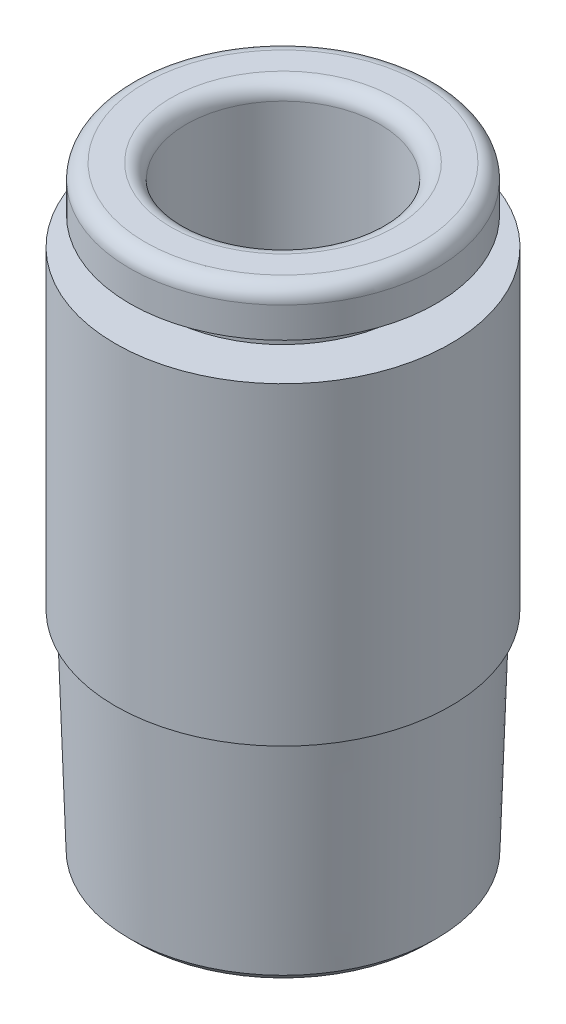
ISO-10303-21;
HEADER;
FILE_DESCRIPTION(('STEP AP214'),'2;1');
FILE_NAME('part.step','',(''),(''),'','','');
FILE_SCHEMA(('AUTOMOTIVE_DESIGN { 1 0 10303 214 1 1 1 1 }'));
ENDSEC;
DATA;
#1=APPLICATION_CONTEXT('core data for automotive mechanical design processes');
#2=APPLICATION_PROTOCOL_DEFINITION('international standard','automotive_design',2000,#1);
#3=PRODUCT_CONTEXT('',#1,'mechanical');
#4=PRODUCT('Part','Part','',(#3));
#5=PRODUCT_RELATED_PRODUCT_CATEGORY('part','',(#4));
#6=PRODUCT_DEFINITION_FORMATION('','',#4);
#7=PRODUCT_DEFINITION_CONTEXT('part definition',#1,'design');
#8=PRODUCT_DEFINITION('design','',#6,#7);
#9=PRODUCT_DEFINITION_SHAPE('','',#8);
#10=(LENGTH_UNIT() NAMED_UNIT(*) SI_UNIT(.MILLI.,.METRE.));
#11=(NAMED_UNIT(*) PLANE_ANGLE_UNIT() SI_UNIT($,.RADIAN.));
#12=(NAMED_UNIT(*) SI_UNIT($,.STERADIAN.) SOLID_ANGLE_UNIT());
#13=UNCERTAINTY_MEASURE_WITH_UNIT(LENGTH_MEASURE(1.E-05),#10,'distance_accuracy_value','');
#14=(GEOMETRIC_REPRESENTATION_CONTEXT(3) GLOBAL_UNCERTAINTY_ASSIGNED_CONTEXT((#13)) GLOBAL_UNIT_ASSIGNED_CONTEXT((#10,
#11,#12)) REPRESENTATION_CONTEXT('',''));
#15=CARTESIAN_POINT('',(0.,0.,0.));
#16=DIRECTION('',(0.,0.,1.));
#17=DIRECTION('',(1.,0.,0.));
#18=AXIS2_PLACEMENT_3D('',#15,#16,#17);
#19=CARTESIAN_POINT('',(0.,-15.3,4.76));
#20=DIRECTION('',(0.,-1.,0.));
#21=DIRECTION('',(0.,0.,-1.));
#22=AXIS2_PLACEMENT_3D('',#19,#20,#21);
#23=PLANE('',#22);
#24=DIRECTION('',(-1.,0.,0.));
#25=VECTOR('',#24,1.);
#26=CARTESIAN_POINT('',(1.37409364067131,-15.3,-2.3101584610165));
#27=LINE('',#26,#25);
#28=CARTESIAN_POINT('',(1.33377060933857,-15.3,-2.3101584610165));
#29=VERTEX_POINT('',#28);
#30=CARTESIAN_POINT('',(0.,-15.3,-2.3101584610165));
#31=VERTEX_POINT('',#30);
#32=EDGE_CURVE('E149',#29,#31,#27,.T.);
#33=ORIENTED_EDGE('',*,*,#32,.T.);
#34=CARTESIAN_POINT('',(0.,-15.3,0.));
#35=DIRECTION('',(0.,-1.,0.));
#36=DIRECTION('',(0.,0.,-1.));
#37=AXIS2_PLACEMENT_3D('',#34,#35,#36);
#38=CIRCLE('',#37,2.3101584610165);
#39=CARTESIAN_POINT('',(2.00065591400786,-15.3,-1.15507923050825));
#40=VERTEX_POINT('',#39);
#41=EDGE_CURVE('E11',#31,#40,#38,.T.);
#42=ORIENTED_EDGE('',*,*,#41,.T.);
#43=DIRECTION('',(-0.5,0.,-0.866025403784439));
#44=VECTOR('',#43,1.);
#45=CARTESIAN_POINT('',(2.68770273434351,-15.3,0.0349207694917477));
#46=LINE('',#45,#44);
#47=EDGE_CURVE('E156',#40,#29,#46,.T.);
#48=ORIENTED_EDGE('',*,*,#47,.T.);
#49=EDGE_LOOP('',(#33,#42,#48));
#50=FACE_BOUND('',#49,.T.);
#51=ADVANCED_FACE('F37',(#50),#23,.F.);
#52=CARTESIAN_POINT('',(2.66754121867714,-15.3,0.));
#53=VERTEX_POINT('',#52);
#54=EDGE_CURVE('E153',#53,#40,#46,.T.);
#55=ORIENTED_EDGE('',*,*,#54,.T.);
#56=CARTESIAN_POINT('',(2.00065591400786,-15.3,1.15507923050825));
#57=VERTEX_POINT('',#56);
#58=EDGE_CURVE('E46',#40,#57,#38,.T.);
#59=ORIENTED_EDGE('',*,*,#58,.T.);
#60=DIRECTION('',(0.5,0.,-0.866025403784438));
#61=VECTOR('',#60,1.);
#62=CARTESIAN_POINT('',(1.3136090936722,-15.3,2.34507923050825));
#63=LINE('',#62,#61);
#64=EDGE_CURVE('E227',#57,#53,#63,.T.);
#65=ORIENTED_EDGE('',*,*,#64,.T.);
#66=EDGE_LOOP('',(#55,#59,#65));
#67=FACE_BOUND('',#66,.T.);
#68=ADVANCED_FACE('F251',(#67),#23,.F.);
#69=CARTESIAN_POINT('',(1.33377060933857,-15.3,2.3101584610165));
#70=VERTEX_POINT('',#69);
#71=EDGE_CURVE('E123',#70,#57,#63,.T.);
#72=ORIENTED_EDGE('',*,*,#71,.T.);
#73=CARTESIAN_POINT('',(0.,-15.3,0.));
#74=DIRECTION('',(0.,1.,0.));
#75=DIRECTION('',(0.,0.,1.));
#76=AXIS2_PLACEMENT_3D('',#73,#74,#75);
#77=CIRCLE('',#76,2.3101584610165);
#78=CARTESIAN_POINT('',(0.,-15.3,2.3101584610165));
#79=VERTEX_POINT('',#78);
#80=EDGE_CURVE('E109',#79,#57,#77,.T.);
#81=ORIENTED_EDGE('',*,*,#80,.F.);
#82=DIRECTION('',(1.,0.,0.));
#83=VECTOR('',#82,1.);
#84=CARTESIAN_POINT('',(-1.37409364067131,-15.3,2.3101584610165));
#85=LINE('',#84,#83);
#86=EDGE_CURVE('E120',#79,#70,#85,.T.);
#87=ORIENTED_EDGE('',*,*,#86,.T.);
#88=EDGE_LOOP('',(#72,#81,#87));
#89=FACE_BOUND('',#88,.T.);
#90=ADVANCED_FACE('F119',(#89),#23,.F.);
#91=CARTESIAN_POINT('',(-1.33377060933857,-15.3,2.3101584610165));
#92=VERTEX_POINT('',#91);
#93=EDGE_CURVE('E130',#92,#79,#85,.T.);
#94=ORIENTED_EDGE('',*,*,#93,.T.);
#95=CARTESIAN_POINT('',(-2.00065591400786,-15.3,1.15507923050825));
#96=VERTEX_POINT('',#95);
#97=EDGE_CURVE('E106',#79,#96,#38,.T.);
#98=ORIENTED_EDGE('',*,*,#97,.T.);
#99=DIRECTION('',(0.5,0.,0.866025403784439));
#100=VECTOR('',#99,1.);
#101=CARTESIAN_POINT('',(-2.68770273434351,-15.3,-0.0349207694917475));
#102=LINE('',#101,#100);
#103=EDGE_CURVE('E135',#96,#92,#102,.T.);
#104=ORIENTED_EDGE('',*,*,#103,.T.);
#105=EDGE_LOOP('',(#94,#98,#104));
#106=FACE_BOUND('',#105,.T.);
#107=ADVANCED_FACE('F134',(#106),#23,.F.);
#108=CARTESIAN_POINT('',(-2.66754121867714,-15.3,0.));
#109=VERTEX_POINT('',#108);
#110=EDGE_CURVE('E132',#109,#96,#102,.T.);
#111=ORIENTED_EDGE('',*,*,#110,.T.);
#112=CARTESIAN_POINT('',(-2.00065591400786,-15.3,-1.15507923050825));
#113=VERTEX_POINT('',#112);
#114=EDGE_CURVE('E112',#96,#113,#38,.T.);
#115=ORIENTED_EDGE('',*,*,#114,.T.);
#116=DIRECTION('',(-0.5,0.,0.866025403784439));
#117=VECTOR('',#116,1.);
#118=CARTESIAN_POINT('',(-1.3136090936722,-15.3,-2.34507923050825));
#119=LINE('',#118,#117);
#120=EDGE_CURVE('E148',#113,#109,#119,.T.);
#121=ORIENTED_EDGE('',*,*,#120,.T.);
#122=EDGE_LOOP('',(#111,#115,#121));
#123=FACE_BOUND('',#122,.T.);
#124=ADVANCED_FACE('F200',(#123),#23,.F.);
#125=CARTESIAN_POINT('',(0.,0.,0.));
#126=DIRECTION('',(0.,1.,0.));
#127=DIRECTION('',(0.,0.,1.));
#128=AXIS2_PLACEMENT_3D('',#125,#126,#127);
#129=CYLINDRICAL_SURFACE('',#128,3.925);
#130=CARTESIAN_POINT('',(0.,-2.4,0.));
#131=DIRECTION('',(0.,1.,0.));
#132=DIRECTION('',(0.,0.,1.));
#133=AXIS2_PLACEMENT_3D('',#130,#131,#132);
#134=CIRCLE('',#133,3.925);
#135=CARTESIAN_POINT('',(0.,-2.4,3.925));
#136=VERTEX_POINT('',#135);
#137=EDGE_CURVE('E169',#136,#136,#134,.F.);
#138=ORIENTED_EDGE('',*,*,#137,.F.);
#139=EDGE_LOOP('',(#138));
#140=FACE_BOUND('',#139,.T.);
#141=CARTESIAN_POINT('',(0.,-1.5,0.));
#142=DIRECTION('',(0.,1.,0.));
#143=DIRECTION('',(0.,0.,1.));
#144=AXIS2_PLACEMENT_3D('',#141,#142,#143);
#145=CIRCLE('',#144,3.925);
#146=CARTESIAN_POINT('',(0.,-1.5,3.925));
#147=VERTEX_POINT('',#146);
#148=EDGE_CURVE('E181',#147,#147,#145,.T.);
#149=ORIENTED_EDGE('',*,*,#148,.F.);
#150=EDGE_LOOP('',(#149));
#151=FACE_BOUND('',#150,.T.);
#152=ADVANCED_FACE('F315',(#140,#151),#129,.T.);
#153=CARTESIAN_POINT('',(-5.025,-1.5,0.));
#154=DIRECTION('',(0.,-1.,0.));
#155=DIRECTION('',(0.,0.,-1.));
#156=AXIS2_PLACEMENT_3D('',#153,#154,#155);
#157=PLANE('',#156);
#158=ORIENTED_EDGE('',*,*,#148,.T.);
#159=EDGE_LOOP('',(#158));
#160=FACE_BOUND('',#159,.T.);
#161=CARTESIAN_POINT('',(0.,-1.5,0.));
#162=DIRECTION('',(0.,1.,0.));
#163=DIRECTION('',(0.,0.,1.));
#164=AXIS2_PLACEMENT_3D('',#161,#162,#163);
#165=CIRCLE('',#164,5.025);
#166=CARTESIAN_POINT('',(0.,-1.5,5.025));
#167=VERTEX_POINT('',#166);
#168=EDGE_CURVE('E178',#167,#167,#165,.T.);
#169=ORIENTED_EDGE('',*,*,#168,.F.);
#170=EDGE_LOOP('',(#169));
#171=FACE_BOUND('',#170,.T.);
#172=ADVANCED_FACE('F311',(#160,#171),#157,.T.);
#173=CARTESIAN_POINT('',(0.,0.,0.));
#174=DIRECTION('',(0.,1.,0.));
#175=DIRECTION('',(0.,0.,1.));
#176=AXIS2_PLACEMENT_3D('',#173,#174,#175);
#177=CYLINDRICAL_SURFACE('',#176,5.025);
#178=ORIENTED_EDGE('',*,*,#168,.T.);
#179=EDGE_LOOP('',(#178));
#180=FACE_BOUND('',#179,.T.);
#181=CARTESIAN_POINT('',(0.,-0.500000000000001,0.));
#182=DIRECTION('',(0.,1.,0.));
#183=DIRECTION('',(0.,0.,1.));
#184=AXIS2_PLACEMENT_3D('',#181,#182,#183);
#185=CIRCLE('',#184,5.025);
#186=CARTESIAN_POINT('',(0.,-0.500000000000001,5.025));
#187=VERTEX_POINT('',#186);
#188=EDGE_CURVE('E175',#187,#187,#185,.T.);
#189=ORIENTED_EDGE('',*,*,#188,.F.);
#190=EDGE_LOOP('',(#189));
#191=FACE_BOUND('',#190,.T.);
#192=ADVANCED_FACE('F307',(#180,#191),#177,.T.);
#193=CARTESIAN_POINT('',(0.,-0.500000000000001,0.));
#194=DIRECTION('',(0.,1.,0.));
#195=DIRECTION('',(0.,0.,1.));
#196=AXIS2_PLACEMENT_3D('',#193,#194,#195);
#197=TOROIDAL_SURFACE('',#196,4.525,0.5);
#198=ORIENTED_EDGE('',*,*,#188,.T.);
#199=EDGE_LOOP('',(#198));
#200=FACE_BOUND('',#199,.T.);
#201=CARTESIAN_POINT('',(0.,0.,0.));
#202=DIRECTION('',(0.,1.,0.));
#203=DIRECTION('',(0.,0.,1.));
#204=AXIS2_PLACEMENT_3D('',#201,#202,#203);
#205=CIRCLE('',#204,4.525);
#206=CARTESIAN_POINT('',(0.,0.,4.525));
#207=VERTEX_POINT('',#206);
#208=EDGE_CURVE('E172',#207,#207,#205,.T.);
#209=ORIENTED_EDGE('',*,*,#208,.F.);
#210=EDGE_LOOP('',(#209));
#211=FACE_BOUND('',#210,.T.);
#212=ADVANCED_FACE('F304',(#200,#211),#197,.T.);
#213=CARTESIAN_POINT('',(0.,0.,0.));
#214=DIRECTION('',(0.,1.,0.));
#215=DIRECTION('',(0.,0.,1.));
#216=AXIS2_PLACEMENT_3D('',#213,#214,#215);
#217=PLANE('',#216);
#218=CARTESIAN_POINT('',(0.,0.,0.));
#219=DIRECTION('',(0.,1.,0.));
#220=DIRECTION('',(0.,0.,1.));
#221=AXIS2_PLACEMENT_3D('',#218,#219,#220);
#222=CIRCLE('',#221,3.675);
#223=CARTESIAN_POINT('',(0.,0.,3.675));
#224=VERTEX_POINT('',#223);
#225=EDGE_CURVE('E192',#224,#224,#222,.F.);
#226=ORIENTED_EDGE('',*,*,#225,.T.);
#227=EDGE_LOOP('',(#226));
#228=FACE_BOUND('',#227,.T.);
#229=ORIENTED_EDGE('',*,*,#208,.T.);
#230=EDGE_LOOP('',(#229));
#231=FACE_BOUND('',#230,.T.);
#232=ADVANCED_FACE('F300',(#228,#231),#217,.T.);
#233=CARTESIAN_POINT('',(0.,-28.256349186104,0.));
#234=DIRECTION('',(0.,1.,0.));
#235=DIRECTION('',(0.,0.,1.));
#236=AXIS2_PLACEMENT_3D('',#233,#234,#235);
#237=CYLINDRICAL_SURFACE('',#236,5.5);
#238=CARTESIAN_POINT('',(0.,-12.7,0.));
#239=DIRECTION('',(0.,1.,0.));
#240=DIRECTION('',(0.,0.,1.));
#241=AXIS2_PLACEMENT_3D('',#238,#239,#240);
#242=CIRCLE('',#241,5.5);
#243=CARTESIAN_POINT('',(0.,-12.7,5.5));
#244=VERTEX_POINT('',#243);
#245=EDGE_CURVE('E166',#244,#244,#242,.F.);
#246=CARTESIAN_POINT('',(0.,-2.4,0.));
#247=DIRECTION('',(0.,1.,0.));
#248=DIRECTION('',(0.,0.,1.));
#249=AXIS2_PLACEMENT_3D('',#246,#247,#248);
#250=CIRCLE('',#249,5.5);
#251=CARTESIAN_POINT('',(0.,-2.4,5.5));
#252=VERTEX_POINT('',#251);
#253=EDGE_CURVE('E163',#252,#252,#250,.T.);
#254=CARTESIAN_POINT('',(0.,-12.7,5.5));
#255=CARTESIAN_POINT('',(0.,-12.5927083333333,5.5));
#256=CARTESIAN_POINT('',(0.,-12.4854166666667,5.5));
#257=CARTESIAN_POINT('',(0.,-12.2708333333333,5.5));
#258=CARTESIAN_POINT('',(0.,-12.1635416666667,5.5));
#259=CARTESIAN_POINT('',(0.,-11.9489583333333,5.5));
#260=CARTESIAN_POINT('',(0.,-11.8416666666667,5.5));
#261=CARTESIAN_POINT('',(0.,-11.6270833333333,5.5));
#262=CARTESIAN_POINT('',(0.,-11.5197916666667,5.5));
#263=CARTESIAN_POINT('',(0.,-11.3052083333333,5.5));
#264=CARTESIAN_POINT('',(0.,-11.1979166666667,5.5));
#265=CARTESIAN_POINT('',(0.,-10.9833333333333,5.5));
#266=CARTESIAN_POINT('',(0.,-10.8760416666667,5.5));
#267=CARTESIAN_POINT('',(0.,-10.6614583333333,5.5));
#268=CARTESIAN_POINT('',(0.,-10.5541666666667,5.5));
#269=CARTESIAN_POINT('',(0.,-10.3395833333333,5.5));
#270=CARTESIAN_POINT('',(0.,-10.2322916666667,5.5));
#271=CARTESIAN_POINT('',(0.,-10.0177083333333,5.5));
#272=CARTESIAN_POINT('',(0.,-9.91041666666667,5.5));
#273=CARTESIAN_POINT('',(0.,-9.69583333333334,5.5));
#274=CARTESIAN_POINT('',(0.,-9.58854166666667,5.5));
#275=CARTESIAN_POINT('',(0.,-9.37395833333334,5.5));
#276=CARTESIAN_POINT('',(0.,-9.26666666666667,5.5));
#277=CARTESIAN_POINT('',(0.,-9.05208333333333,5.5));
#278=CARTESIAN_POINT('',(0.,-8.94479166666667,5.5));
#279=CARTESIAN_POINT('',(0.,-8.73020833333334,5.5));
#280=CARTESIAN_POINT('',(0.,-8.62291666666667,5.5));
#281=CARTESIAN_POINT('',(0.,-8.40833333333333,5.5));
#282=CARTESIAN_POINT('',(0.,-8.30104166666667,5.5));
#283=CARTESIAN_POINT('',(0.,-8.08645833333333,5.5));
#284=CARTESIAN_POINT('',(0.,-7.97916666666667,5.5));
#285=CARTESIAN_POINT('',(0.,-7.76458333333333,5.5));
#286=CARTESIAN_POINT('',(0.,-7.65729166666667,5.5));
#287=CARTESIAN_POINT('',(0.,-7.44270833333333,5.5));
#288=CARTESIAN_POINT('',(0.,-7.33541666666667,5.5));
#289=CARTESIAN_POINT('',(0.,-7.12083333333334,5.5));
#290=CARTESIAN_POINT('',(0.,-7.01354166666667,5.5));
#291=CARTESIAN_POINT('',(0.,-6.79895833333333,5.5));
#292=CARTESIAN_POINT('',(0.,-6.69166666666667,5.5));
#293=CARTESIAN_POINT('',(0.,-6.47708333333333,5.5));
#294=CARTESIAN_POINT('',(0.,-6.36979166666667,5.5));
#295=CARTESIAN_POINT('',(0.,-6.15520833333333,5.5));
#296=CARTESIAN_POINT('',(0.,-6.04791666666667,5.5));
#297=CARTESIAN_POINT('',(0.,-5.83333333333333,5.5));
#298=CARTESIAN_POINT('',(0.,-5.72604166666667,5.5));
#299=CARTESIAN_POINT('',(0.,-5.51145833333333,5.5));
#300=CARTESIAN_POINT('',(0.,-5.40416666666667,5.5));
#301=CARTESIAN_POINT('',(0.,-5.18958333333333,5.5));
#302=CARTESIAN_POINT('',(0.,-5.08229166666667,5.5));
#303=CARTESIAN_POINT('',(0.,-4.86770833333333,5.5));
#304=CARTESIAN_POINT('',(0.,-4.76041666666667,5.5));
#305=CARTESIAN_POINT('',(0.,-4.54583333333334,5.5));
#306=CARTESIAN_POINT('',(0.,-4.43854166666667,5.5));
#307=CARTESIAN_POINT('',(0.,-4.22395833333333,5.5));
#308=CARTESIAN_POINT('',(0.,-4.11666666666667,5.5));
#309=CARTESIAN_POINT('',(0.,-3.90208333333333,5.5));
#310=CARTESIAN_POINT('',(0.,-3.79479166666667,5.5));
#311=CARTESIAN_POINT('',(0.,-3.58020833333333,5.5));
#312=CARTESIAN_POINT('',(0.,-3.47291666666667,5.5));
#313=CARTESIAN_POINT('',(0.,-3.25833333333333,5.5));
#314=CARTESIAN_POINT('',(0.,-3.15104166666667,5.5));
#315=CARTESIAN_POINT('',(0.,-2.93645833333333,5.5));
#316=CARTESIAN_POINT('',(0.,-2.82916666666667,5.5));
#317=CARTESIAN_POINT('',(0.,-2.61458333333333,5.5));
#318=CARTESIAN_POINT('',(0.,-2.50729166666667,5.5));
#319=CARTESIAN_POINT('',(0.,-2.4,5.5));
#320=B_SPLINE_CURVE_WITH_KNOTS('',3,(#254,#255,#256,#257,#258,#259,#260,#261,#262,#263,#264,
#265,#266,#267,#268,#269,#270,#271,#272,#273,#274,#275,#276,#277,#278,#279,#280,#281,#282,#283,
#284,#285,#286,#287,#288,#289,#290,#291,#292,#293,#294,#295,#296,#297,#298,#299,#300,#301,#302,
#303,#304,#305,#306,#307,#308,#309,#310,#311,#312,#313,#314,#315,#316,#317,#318,#319),
.UNSPECIFIED.,.F.,.F.,(4,2,2,2,2,2,2,2,2,2,2,2,2,2,2,2,2,2,2,2,2,2,2,2,2,2,2,2,2,2,2,2,4),(0.,
0.321874999999998,0.643749999999997,0.965625,1.2875,1.609375,1.93125,2.253125,2.575,2.896875,
3.21875,3.540625,3.8625,4.184375,4.50625,4.828125,5.15,5.471875,5.79375,6.115625,6.4375,
6.759375,7.08125,7.403125,7.725,8.046875,8.36875,8.690625,9.0125,9.334375,9.65625,9.978125,
10.3),.UNSPECIFIED.);
#321=EDGE_CURVE('BSEAM296',#244,#252,#320,.T.);
#322=ORIENTED_EDGE('',*,*,#245,.F.);
#323=ORIENTED_EDGE('',*,*,#253,.F.);
#324=ORIENTED_EDGE('',*,*,#321,.T.);
#325=ORIENTED_EDGE('',*,*,#321,.F.);
#326=EDGE_LOOP('',(#322,#324,#323,#325));
#327=FACE_BOUND('',#326,.T.);
#328=ADVANCED_FACE('F296',(#327),#237,.T.);
#329=CARTESIAN_POINT('',(0.,-2.4,0.));
#330=DIRECTION('',(0.,1.,0.));
#331=DIRECTION('',(0.,0.,1.));
#332=AXIS2_PLACEMENT_3D('',#329,#330,#331);
#333=PLANE('',#332);
#334=ORIENTED_EDGE('',*,*,#137,.T.);
#335=EDGE_LOOP('',(#334));
#336=FACE_BOUND('',#335,.T.);
#337=ORIENTED_EDGE('',*,*,#253,.T.);
#338=EDGE_LOOP('',(#337));
#339=FACE_BOUND('',#338,.T.);
#340=ADVANCED_FACE('F292',(#336,#339),#333,.T.);
#341=CARTESIAN_POINT('',(0.,-12.7,0.));
#342=DIRECTION('',(0.,1.,0.));
#343=DIRECTION('',(0.,0.,1.));
#344=AXIS2_PLACEMENT_3D('',#341,#342,#343);
#345=PLANE('',#344);
#346=CARTESIAN_POINT('',(0.,-12.7,0.));
#347=DIRECTION('',(0.,1.,0.));
#348=DIRECTION('',(0.,0.,1.));
#349=AXIS2_PLACEMENT_3D('',#346,#347,#348);
#350=CIRCLE('',#349,5.24748929625027);
#351=CARTESIAN_POINT('',(0.,-12.7,5.24748929625027));
#352=VERTEX_POINT('',#351);
#353=EDGE_CURVE('E160',#352,#352,#350,.T.);
#354=ORIENTED_EDGE('',*,*,#353,.T.);
#355=EDGE_LOOP('',(#354));
#356=FACE_BOUND('',#355,.T.);
#357=ORIENTED_EDGE('',*,*,#245,.T.);
#358=EDGE_LOOP('',(#357));
#359=FACE_BOUND('',#358,.T.);
#360=ADVANCED_FACE('F289',(#356,#359),#345,.F.);
#361=CARTESIAN_POINT('',(-5.02634744213624,-19.8,0.));
#362=DIRECTION('',(0.,-1.,0.));
#363=DIRECTION('',(0.,0.,-1.));
#364=AXIS2_PLACEMENT_3D('',#361,#362,#363);
#365=PLANE('',#364);
#366=CARTESIAN_POINT('',(0.,-19.8,0.));
#367=DIRECTION('',(0.,1.,0.));
#368=DIRECTION('',(0.,0.,1.));
#369=AXIS2_PLACEMENT_3D('',#366,#367,#368);
#370=CIRCLE('',#369,2.3101584610165);
#371=CARTESIAN_POINT('',(0.,-19.8,2.3101584610165));
#372=VERTEX_POINT('',#371);
#373=EDGE_CURVE('E124',#372,#372,#370,.T.);
#374=ORIENTED_EDGE('',*,*,#373,.T.);
#375=EDGE_LOOP('',(#374));
#376=FACE_BOUND('',#375,.T.);
#377=CARTESIAN_POINT('',(0.,-19.8,0.));
#378=DIRECTION('',(0.,-1.,0.));
#379=DIRECTION('',(0.,0.,-1.));
#380=AXIS2_PLACEMENT_3D('',#377,#378,#379);
#381=CIRCLE('',#380,4.77634744213624);
#382=CARTESIAN_POINT('',(0.,-19.8,-4.77634744213624));
#383=VERTEX_POINT('',#382);
#384=EDGE_CURVE('E187',#383,#383,#381,.T.);
#385=ORIENTED_EDGE('',*,*,#384,.T.);
#386=EDGE_LOOP('',(#385));
#387=FACE_BOUND('',#386,.T.);
#388=ADVANCED_FACE('F240',(#376,#387),#365,.T.);
#389=CARTESIAN_POINT('',(0.,-12.7,0.));
#390=DIRECTION('',(0.,1.,0.));
#391=DIRECTION('',(0.,0.,1.));
#392=AXIS2_PLACEMENT_3D('',#389,#390,#391);
#393=CONICAL_SURFACE('',#392,5.24748929625027,0.031136673855583);
#394=CARTESIAN_POINT('',(0.,-19.5419629882815,0.));
#395=DIRECTION('',(0.,-1.,0.));
#396=DIRECTION('',(0.,0.,-1.));
#397=AXIS2_PLACEMENT_3D('',#394,#395,#396);
#398=CIRCLE('',#397,5.03438445385476);
#399=CARTESIAN_POINT('',(0.,-19.5419629882815,-5.03438445385476));
#400=VERTEX_POINT('',#399);
#401=EDGE_CURVE('E184',#400,#400,#398,.F.);
#402=ORIENTED_EDGE('',*,*,#401,.T.);
#403=EDGE_LOOP('',(#402));
#404=FACE_BOUND('',#403,.T.);
#405=ORIENTED_EDGE('',*,*,#353,.F.);
#406=EDGE_LOOP('',(#405));
#407=FACE_BOUND('',#406,.T.);
#408=ADVANCED_FACE('F283',(#404,#407),#393,.T.);
#409=CARTESIAN_POINT('',(0.,-19.5419629882815,0.));
#410=DIRECTION('',(0.,1.,0.));
#411=DIRECTION('',(0.,0.,1.));
#412=AXIS2_PLACEMENT_3D('',#409,#410,#411);
#413=CONICAL_SURFACE('',#412,5.03438445385476,0.785398163397445);
#414=ORIENTED_EDGE('',*,*,#384,.F.);
#415=EDGE_LOOP('',(#414));
#416=FACE_BOUND('',#415,.T.);
#417=ORIENTED_EDGE('',*,*,#401,.F.);
#418=EDGE_LOOP('',(#417));
#419=FACE_BOUND('',#418,.T.);
#420=ADVANCED_FACE('F281',(#416,#419),#413,.T.);
#421=CARTESIAN_POINT('',(0.,-22.2802561210692,0.));
#422=DIRECTION('',(0.,1.,0.));
#423=DIRECTION('',(0.,0.,1.));
#424=AXIS2_PLACEMENT_3D('',#421,#422,#423);
#425=CYLINDRICAL_SURFACE('',#424,3.175);
#426=CARTESIAN_POINT('',(0.,-0.5,0.));
#427=DIRECTION('',(0.,1.,0.));
#428=DIRECTION('',(0.,0.,1.));
#429=AXIS2_PLACEMENT_3D('',#426,#427,#428);
#430=CIRCLE('',#429,3.175);
#431=CARTESIAN_POINT('',(0.,-0.5,3.175));
#432=VERTEX_POINT('',#431);
#433=EDGE_CURVE('E190',#432,#432,#430,.T.);
#434=CARTESIAN_POINT('',(0.,-13.3,0.));
#435=DIRECTION('',(0.,1.,0.));
#436=DIRECTION('',(0.,0.,1.));
#437=AXIS2_PLACEMENT_3D('',#434,#435,#436);
#438=CIRCLE('',#437,3.175);
#439=CARTESIAN_POINT('',(0.,-13.3,3.175));
#440=VERTEX_POINT('',#439);
#441=EDGE_CURVE('E157',#440,#440,#438,.F.);
#442=CARTESIAN_POINT('',(0.,-0.5,3.175));
#443=CARTESIAN_POINT('',(0.,-0.633333333333334,3.175));
#444=CARTESIAN_POINT('',(0.,-0.766666666666668,3.175));
#445=CARTESIAN_POINT('',(0.,-1.03333333333333,3.175));
#446=CARTESIAN_POINT('',(0.,-1.16666666666667,3.175));
#447=CARTESIAN_POINT('',(0.,-1.43333333333333,3.175));
#448=CARTESIAN_POINT('',(0.,-1.56666666666667,3.175));
#449=CARTESIAN_POINT('',(0.,-1.83333333333333,3.175));
#450=CARTESIAN_POINT('',(0.,-1.96666666666667,3.175));
#451=CARTESIAN_POINT('',(0.,-2.23333333333334,3.175));
#452=CARTESIAN_POINT('',(0.,-2.36666666666667,3.175));
#453=CARTESIAN_POINT('',(0.,-2.63333333333333,3.175));
#454=CARTESIAN_POINT('',(0.,-2.76666666666667,3.175));
#455=CARTESIAN_POINT('',(0.,-3.03333333333333,3.175));
#456=CARTESIAN_POINT('',(0.,-3.16666666666667,3.175));
#457=CARTESIAN_POINT('',(0.,-3.43333333333333,3.175));
#458=CARTESIAN_POINT('',(0.,-3.56666666666667,3.175));
#459=CARTESIAN_POINT('',(0.,-3.83333333333333,3.175));
#460=CARTESIAN_POINT('',(0.,-3.96666666666667,3.175));
#461=CARTESIAN_POINT('',(0.,-4.23333333333333,3.175));
#462=CARTESIAN_POINT('',(0.,-4.36666666666667,3.175));
#463=CARTESIAN_POINT('',(0.,-4.63333333333333,3.175));
#464=CARTESIAN_POINT('',(0.,-4.76666666666667,3.175));
#465=CARTESIAN_POINT('',(0.,-5.03333333333333,3.175));
#466=CARTESIAN_POINT('',(0.,-5.16666666666667,3.175));
#467=CARTESIAN_POINT('',(0.,-5.43333333333333,3.175));
#468=CARTESIAN_POINT('',(0.,-5.56666666666667,3.175));
#469=CARTESIAN_POINT('',(0.,-5.83333333333333,3.175));
#470=CARTESIAN_POINT('',(0.,-5.96666666666667,3.175));
#471=CARTESIAN_POINT('',(0.,-6.23333333333333,3.175));
#472=CARTESIAN_POINT('',(0.,-6.36666666666667,3.175));
#473=CARTESIAN_POINT('',(0.,-6.63333333333333,3.175));
#474=CARTESIAN_POINT('',(0.,-6.76666666666667,3.175));
#475=CARTESIAN_POINT('',(0.,-7.03333333333333,3.175));
#476=CARTESIAN_POINT('',(0.,-7.16666666666667,3.175));
#477=CARTESIAN_POINT('',(0.,-7.43333333333333,3.175));
#478=CARTESIAN_POINT('',(0.,-7.56666666666667,3.175));
#479=CARTESIAN_POINT('',(0.,-7.83333333333333,3.175));
#480=CARTESIAN_POINT('',(0.,-7.96666666666667,3.175));
#481=CARTESIAN_POINT('',(0.,-8.23333333333333,3.175));
#482=CARTESIAN_POINT('',(0.,-8.36666666666667,3.175));
#483=CARTESIAN_POINT('',(0.,-8.63333333333333,3.175));
#484=CARTESIAN_POINT('',(0.,-8.76666666666667,3.175));
#485=CARTESIAN_POINT('',(0.,-9.03333333333333,3.175));
#486=CARTESIAN_POINT('',(0.,-9.16666666666667,3.175));
#487=CARTESIAN_POINT('',(0.,-9.43333333333333,3.175));
#488=CARTESIAN_POINT('',(0.,-9.56666666666667,3.175));
#489=CARTESIAN_POINT('',(0.,-9.83333333333333,3.175));
#490=CARTESIAN_POINT('',(0.,-9.96666666666667,3.175));
#491=CARTESIAN_POINT('',(0.,-10.2333333333333,3.175));
#492=CARTESIAN_POINT('',(0.,-10.3666666666667,3.175));
#493=CARTESIAN_POINT('',(0.,-10.6333333333333,3.175));
#494=CARTESIAN_POINT('',(0.,-10.7666666666667,3.175));
#495=CARTESIAN_POINT('',(0.,-11.0333333333333,3.175));
#496=CARTESIAN_POINT('',(0.,-11.1666666666667,3.175));
#497=CARTESIAN_POINT('',(0.,-11.4333333333333,3.175));
#498=CARTESIAN_POINT('',(0.,-11.5666666666667,3.175));
#499=CARTESIAN_POINT('',(0.,-11.8333333333333,3.175));
#500=CARTESIAN_POINT('',(0.,-11.9666666666667,3.175));
#501=CARTESIAN_POINT('',(0.,-12.2333333333333,3.175));
#502=CARTESIAN_POINT('',(0.,-12.3666666666667,3.175));
#503=CARTESIAN_POINT('',(0.,-12.6333333333333,3.175));
#504=CARTESIAN_POINT('',(0.,-12.7666666666667,3.175));
#505=CARTESIAN_POINT('',(0.,-13.0333333333333,3.175));
#506=CARTESIAN_POINT('',(0.,-13.1666666666667,3.175));
#507=CARTESIAN_POINT('',(0.,-13.3,3.175));
#508=B_SPLINE_CURVE_WITH_KNOTS('',3,(#442,#443,#444,#445,#446,#447,#448,#449,#450,#451,#452,
#453,#454,#455,#456,#457,#458,#459,#460,#461,#462,#463,#464,#465,#466,#467,#468,#469,#470,#471,
#472,#473,#474,#475,#476,#477,#478,#479,#480,#481,#482,#483,#484,#485,#486,#487,#488,#489,#490,
#491,#492,#493,#494,#495,#496,#497,#498,#499,#500,#501,#502,#503,#504,#505,#506,#507),
.UNSPECIFIED.,.F.,.F.,(4,2,2,2,2,2,2,2,2,2,2,2,2,2,2,2,2,2,2,2,2,2,2,2,2,2,2,2,2,2,2,2,4),(0.,
0.400000000000001,0.799999999999999,1.2,1.6,2.,2.4,2.8,3.2,3.6,4.,4.4,4.8,5.2,5.6,6.,6.4,6.8,
7.2,7.6,8.,8.4,8.8,9.2,9.6,10.,10.4,10.8,11.2,11.6,12.,12.4,12.8),.UNSPECIFIED.);
#509=EDGE_CURVE('BSEAM277',#432,#440,#508,.T.);
#510=ORIENTED_EDGE('',*,*,#433,.T.);
#511=ORIENTED_EDGE('',*,*,#441,.T.);
#512=ORIENTED_EDGE('',*,*,#509,.T.);
#513=ORIENTED_EDGE('',*,*,#509,.F.);
#514=EDGE_LOOP('',(#510,#512,#511,#513));
#515=FACE_BOUND('',#514,.T.);
#516=ADVANCED_FACE('F277',(#515),#425,.F.);
#517=CARTESIAN_POINT('',(0.,-13.3,0.));
#518=DIRECTION('',(0.,1.,0.));
#519=DIRECTION('',(0.,0.,1.));
#520=AXIS2_PLACEMENT_3D('',#517,#518,#519);
#521=PLANE('',#520);
#522=DIRECTION('',(0.5,0.,-0.866025403784439));
#523=VECTOR('',#522,1.);
#524=CARTESIAN_POINT('',(1.37409364067131,-13.3,2.38));
#525=LINE('',#524,#523);
#526=CARTESIAN_POINT('',(1.37409364067131,-13.3,2.38));
#527=VERTEX_POINT('',#526);
#528=CARTESIAN_POINT('',(2.74818728134262,-13.3,0.));
#529=VERTEX_POINT('',#528);
#530=EDGE_CURVE('E59',#527,#529,#525,.T.);
#531=ORIENTED_EDGE('',*,*,#530,.F.);
#532=DIRECTION('',(1.,0.,0.));
#533=VECTOR('',#532,1.);
#534=CARTESIAN_POINT('',(-1.37409364067131,-13.3,2.38));
#535=LINE('',#534,#533);
#536=CARTESIAN_POINT('',(-1.37409364067131,-13.3,2.38));
#537=VERTEX_POINT('',#536);
#538=EDGE_CURVE('E225',#537,#527,#535,.T.);
#539=ORIENTED_EDGE('',*,*,#538,.F.);
#540=DIRECTION('',(0.5,0.,0.866025403784439));
#541=VECTOR('',#540,1.);
#542=CARTESIAN_POINT('',(-2.74818728134262,-13.3,0.));
#543=LINE('',#542,#541);
#544=CARTESIAN_POINT('',(-2.74818728134262,-13.3,0.));
#545=VERTEX_POINT('',#544);
#546=EDGE_CURVE('E228',#545,#537,#543,.T.);
#547=ORIENTED_EDGE('',*,*,#546,.F.);
#548=DIRECTION('',(-0.5,0.,0.866025403784439));
#549=VECTOR('',#548,1.);
#550=CARTESIAN_POINT('',(-1.37409364067131,-13.3,-2.38));
#551=LINE('',#550,#549);
#552=CARTESIAN_POINT('',(-1.37409364067131,-13.3,-2.38));
#553=VERTEX_POINT('',#552);
#554=EDGE_CURVE('E230',#553,#545,#551,.T.);
#555=ORIENTED_EDGE('',*,*,#554,.F.);
#556=DIRECTION('',(-1.,0.,0.));
#557=VECTOR('',#556,1.);
#558=CARTESIAN_POINT('',(1.37409364067131,-13.3,-2.38));
#559=LINE('',#558,#557);
#560=CARTESIAN_POINT('',(1.37409364067131,-13.3,-2.38));
#561=VERTEX_POINT('',#560);
#562=EDGE_CURVE('E216',#561,#553,#559,.T.);
#563=ORIENTED_EDGE('',*,*,#562,.F.);
#564=DIRECTION('',(-0.5,0.,-0.866025403784439));
#565=VECTOR('',#564,1.);
#566=CARTESIAN_POINT('',(2.74818728134262,-13.3,0.));
#567=LINE('',#566,#565);
#568=EDGE_CURVE('E233',#529,#561,#567,.T.);
#569=ORIENTED_EDGE('',*,*,#568,.F.);
#570=EDGE_LOOP('',(#531,#539,#547,#555,#563,#569));
#571=FACE_BOUND('',#570,.T.);
#572=ORIENTED_EDGE('',*,*,#441,.F.);
#573=EDGE_LOOP('',(#572));
#574=FACE_BOUND('',#573,.T.);
#575=ADVANCED_FACE('F274',(#571,#574),#521,.T.);
#576=CARTESIAN_POINT('',(0.,-0.5,0.));
#577=DIRECTION('',(0.,1.,0.));
#578=DIRECTION('',(0.,0.,1.));
#579=AXIS2_PLACEMENT_3D('',#576,#577,#578);
#580=TOROIDAL_SURFACE('',#579,3.675,0.5);
#581=ORIENTED_EDGE('',*,*,#225,.F.);
#582=EDGE_LOOP('',(#581));
#583=FACE_BOUND('',#582,.T.);
#584=ORIENTED_EDGE('',*,*,#433,.F.);
#585=EDGE_LOOP('',(#584));
#586=FACE_BOUND('',#585,.T.);
#587=ADVANCED_FACE('F39',(#583,#586),#580,.T.);
#588=CARTESIAN_POINT('',(1.37409364067131,-13.3,2.38));
#589=DIRECTION('',(0.865497844507676,-0.034899496702501,0.499695413509548));
#590=DIRECTION('',(0.5,0.,-0.866025403784438));
#591=AXIS2_PLACEMENT_3D('',#588,#589,#590);
#592=PLANE('',#591);
#593=ORIENTED_EDGE('',*,*,#530,.T.);
#594=DIRECTION('',(0.0402902897014406,0.999188016619382,0.));
#595=VECTOR('',#594,1.);
#596=CARTESIAN_POINT('',(2.74595670490665,-13.3553176773234,0.));
#597=LINE('',#596,#595);
#598=EDGE_CURVE('E137',#53,#529,#597,.T.);
#599=ORIENTED_EDGE('',*,*,#598,.F.);
#600=ORIENTED_EDGE('',*,*,#64,.F.);
#601=ORIENTED_EDGE('',*,*,#71,.F.);
#602=DIRECTION('',(0.0201451448507203,0.999188016619382,0.0348924144072821));
#603=VECTOR('',#602,1.);
#604=CARTESIAN_POINT('',(1.37297835245333,-13.3553176773234,2.37806826414137));
#605=LINE('',#604,#603);
#606=EDGE_CURVE('E131',#70,#527,#605,.T.);
#607=ORIENTED_EDGE('',*,*,#606,.T.);
#608=EDGE_LOOP('',(#593,#599,#600,#601,#607));
#609=FACE_BOUND('',#608,.T.);
#610=ADVANCED_FACE('F258',(#609),#592,.F.);
#611=CARTESIAN_POINT('',(-1.37409364067131,-13.3,2.38));
#612=DIRECTION('',(0.,-0.034899496702501,0.999390827019096));
#613=DIRECTION('',(0.,-0.999390827019096,-0.034899496702501));
#614=AXIS2_PLACEMENT_3D('',#611,#612,#613);
#615=PLANE('',#614);
#616=ORIENTED_EDGE('',*,*,#538,.T.);
#617=ORIENTED_EDGE('',*,*,#606,.F.);
#618=ORIENTED_EDGE('',*,*,#86,.F.);
#619=ORIENTED_EDGE('',*,*,#93,.F.);
#620=DIRECTION('',(-0.0201451448507203,0.999188016619382,0.0348924144072821));
#621=VECTOR('',#620,1.);
#622=CARTESIAN_POINT('',(-1.37297835245333,-13.3553176773234,2.37806826414137));
#623=LINE('',#622,#621);
#624=EDGE_CURVE('E219',#92,#537,#623,.T.);
#625=ORIENTED_EDGE('',*,*,#624,.T.);
#626=EDGE_LOOP('',(#616,#617,#618,#619,#625));
#627=FACE_BOUND('',#626,.T.);
#628=ADVANCED_FACE('F129',(#627),#615,.F.);
#629=CARTESIAN_POINT('',(-2.74818728134262,-13.3,0.));
#630=DIRECTION('',(-0.865497844507677,-0.034899496702501,0.499695413509548));
#631=DIRECTION('',(0.5,0.,0.866025403784439));
#632=AXIS2_PLACEMENT_3D('',#629,#630,#631);
#633=PLANE('',#632);
#634=ORIENTED_EDGE('',*,*,#546,.T.);
#635=ORIENTED_EDGE('',*,*,#624,.F.);
#636=ORIENTED_EDGE('',*,*,#103,.F.);
#637=ORIENTED_EDGE('',*,*,#110,.F.);
#638=DIRECTION('',(-0.0402902897014406,0.999188016619382,0.));
#639=VECTOR('',#638,1.);
#640=CARTESIAN_POINT('',(-2.74595670490665,-13.3553176773234,0.));
#641=LINE('',#640,#639);
#642=EDGE_CURVE('E207',#109,#545,#641,.T.);
#643=ORIENTED_EDGE('',*,*,#642,.T.);
#644=EDGE_LOOP('',(#634,#635,#636,#637,#643));
#645=FACE_BOUND('',#644,.T.);
#646=ADVANCED_FACE('F268',(#645),#633,.F.);
#647=CARTESIAN_POINT('',(-1.37409364067131,-13.3,-2.38));
#648=DIRECTION('',(-0.865497844507677,-0.034899496702501,-0.499695413509548));
#649=DIRECTION('',(-0.5,0.,0.866025403784439));
#650=AXIS2_PLACEMENT_3D('',#647,#648,#649);
#651=PLANE('',#650);
#652=ORIENTED_EDGE('',*,*,#554,.T.);
#653=ORIENTED_EDGE('',*,*,#642,.F.);
#654=ORIENTED_EDGE('',*,*,#120,.F.);
#655=CARTESIAN_POINT('',(-1.33377060933857,-15.3,-2.3101584610165));
#656=VERTEX_POINT('',#655);
#657=EDGE_CURVE('E145',#656,#113,#119,.T.);
#658=ORIENTED_EDGE('',*,*,#657,.F.);
#659=DIRECTION('',(-0.0201451448507203,0.999188016619382,-0.0348924144072821));
#660=VECTOR('',#659,1.);
#661=CARTESIAN_POINT('',(-1.37297835245333,-13.3553176773234,-2.37806826414137));
#662=LINE('',#661,#660);
#663=EDGE_CURVE('E213',#656,#553,#662,.T.);
#664=ORIENTED_EDGE('',*,*,#663,.T.);
#665=EDGE_LOOP('',(#652,#653,#654,#658,#664));
#666=FACE_BOUND('',#665,.T.);
#667=ADVANCED_FACE('F206',(#666),#651,.F.);
#668=CARTESIAN_POINT('',(1.37409364067131,-13.3,-2.38));
#669=DIRECTION('',(0.,-0.034899496702501,-0.999390827019096));
#670=DIRECTION('',(0.,0.999390827019096,-0.034899496702501));
#671=AXIS2_PLACEMENT_3D('',#668,#669,#670);
#672=PLANE('',#671);
#673=ORIENTED_EDGE('',*,*,#562,.T.);
#674=ORIENTED_EDGE('',*,*,#663,.F.);
#675=EDGE_CURVE('E152',#31,#656,#27,.T.);
#676=ORIENTED_EDGE('',*,*,#675,.F.);
#677=ORIENTED_EDGE('',*,*,#32,.F.);
#678=DIRECTION('',(0.0201451448507203,0.999188016619382,-0.0348924144072821));
#679=VECTOR('',#678,1.);
#680=CARTESIAN_POINT('',(1.37297835245333,-13.3553176773234,-2.37806826414137));
#681=LINE('',#680,#679);
#682=EDGE_CURVE('E138',#29,#561,#681,.T.);
#683=ORIENTED_EDGE('',*,*,#682,.T.);
#684=EDGE_LOOP('',(#673,#674,#676,#677,#683));
#685=FACE_BOUND('',#684,.T.);
#686=ADVANCED_FACE('F214',(#685),#672,.F.);
#687=CARTESIAN_POINT('',(2.74818728134262,-13.3,0.));
#688=DIRECTION('',(0.865497844507677,-0.034899496702501,-0.499695413509547));
#689=DIRECTION('',(-0.5,0.,-0.866025403784439));
#690=AXIS2_PLACEMENT_3D('',#687,#688,#689);
#691=PLANE('',#690);
#692=ORIENTED_EDGE('',*,*,#568,.T.);
#693=ORIENTED_EDGE('',*,*,#682,.F.);
#694=ORIENTED_EDGE('',*,*,#47,.F.);
#695=ORIENTED_EDGE('',*,*,#54,.F.);
#696=ORIENTED_EDGE('',*,*,#598,.T.);
#697=EDGE_LOOP('',(#692,#693,#694,#695,#696));
#698=FACE_BOUND('',#697,.T.);
#699=ADVANCED_FACE('F248',(#698),#691,.F.);
#700=ORIENTED_EDGE('',*,*,#657,.T.);
#701=EDGE_CURVE('E41',#113,#31,#38,.T.);
#702=ORIENTED_EDGE('',*,*,#701,.T.);
#703=ORIENTED_EDGE('',*,*,#675,.T.);
#704=EDGE_LOOP('',(#700,#702,#703));
#705=FACE_BOUND('',#704,.T.);
#706=ADVANCED_FACE('F208',(#705),#23,.F.);
#707=CARTESIAN_POINT('',(0.,-19.8,0.));
#708=DIRECTION('',(0.,1.,0.));
#709=DIRECTION('',(0.,0.,1.));
#710=AXIS2_PLACEMENT_3D('',#707,#708,#709);
#711=CYLINDRICAL_SURFACE('',#710,2.3101584610165);
#712=ORIENTED_EDGE('',*,*,#373,.F.);
#713=EDGE_LOOP('',(#712));
#714=FACE_BOUND('',#713,.T.);
#715=ORIENTED_EDGE('',*,*,#80,.T.);
#716=ORIENTED_EDGE('',*,*,#58,.F.);
#717=ORIENTED_EDGE('',*,*,#41,.F.);
#718=ORIENTED_EDGE('',*,*,#701,.F.);
#719=ORIENTED_EDGE('',*,*,#114,.F.);
#720=ORIENTED_EDGE('',*,*,#97,.F.);
#721=EDGE_LOOP('',(#715,#716,#717,#718,#719,#720));
#722=FACE_BOUND('',#721,.T.);
#723=ADVANCED_FACE('F108',(#714,#722),#711,.F.);
#724=CLOSED_SHELL('',(#51,#68,#90,#107,#124,#152,#172,#192,#212,#232,#328,#340,#360,#388,#408,
#420,#516,#575,#587,#610,#628,#646,#667,#686,#699,#706,#723));
#725=MANIFOLD_SOLID_BREP('B2',#724);
#726=ADVANCED_BREP_SHAPE_REPRESENTATION('',(#18,#725),#14);
#727=SHAPE_DEFINITION_REPRESENTATION(#9,#726);
ENDSEC;
END-ISO-10303-21;
